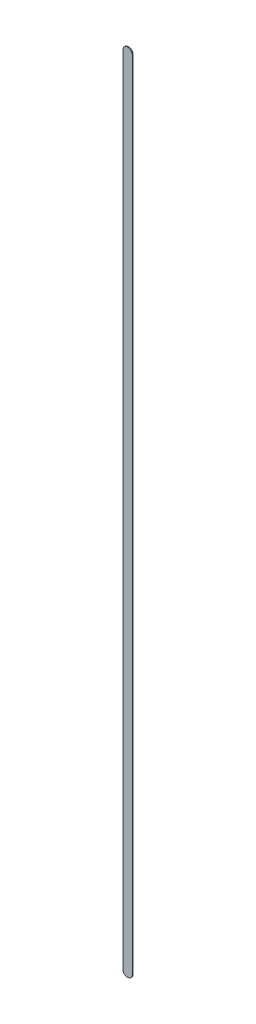
ISO-10303-21;
HEADER;
FILE_DESCRIPTION(('STEP AP214'),'2;1');
FILE_NAME('part.step','',(''),(''),'','','');
FILE_SCHEMA(('AUTOMOTIVE_DESIGN { 1 0 10303 214 1 1 1 1 }'));
ENDSEC;
DATA;
#1=APPLICATION_CONTEXT('core data for automotive mechanical design processes');
#2=APPLICATION_PROTOCOL_DEFINITION('international standard','automotive_design',2000,#1);
#3=PRODUCT_CONTEXT('',#1,'mechanical');
#4=PRODUCT('Part','Part','',(#3));
#5=PRODUCT_RELATED_PRODUCT_CATEGORY('part','',(#4));
#6=PRODUCT_DEFINITION_FORMATION('','',#4);
#7=PRODUCT_DEFINITION_CONTEXT('part definition',#1,'design');
#8=PRODUCT_DEFINITION('design','',#6,#7);
#9=PRODUCT_DEFINITION_SHAPE('','',#8);
#10=(LENGTH_UNIT() NAMED_UNIT(*) SI_UNIT(.MILLI.,.METRE.));
#11=(NAMED_UNIT(*) PLANE_ANGLE_UNIT() SI_UNIT($,.RADIAN.));
#12=(NAMED_UNIT(*) SI_UNIT($,.STERADIAN.) SOLID_ANGLE_UNIT());
#13=UNCERTAINTY_MEASURE_WITH_UNIT(LENGTH_MEASURE(1.E-05),#10,'distance_accuracy_value','');
#14=(GEOMETRIC_REPRESENTATION_CONTEXT(3) GLOBAL_UNCERTAINTY_ASSIGNED_CONTEXT((#13)) GLOBAL_UNIT_ASSIGNED_CONTEXT((#10,
#11,#12)) REPRESENTATION_CONTEXT('',''));
#15=CARTESIAN_POINT('',(0.,0.,0.));
#16=DIRECTION('',(0.,0.,1.));
#17=DIRECTION('',(1.,0.,0.));
#18=AXIS2_PLACEMENT_3D('',#15,#16,#17);
#19=CARTESIAN_POINT('',(34.375,48.9125,1.1596000001));
#20=DIRECTION('',(0.,0.,1.));
#21=DIRECTION('',(1.,0.,0.));
#22=AXIS2_PLACEMENT_3D('',#19,#20,#21);
#23=PLANE('',#22);
#24=DIRECTION('',(0.,1.,0.));
#25=VECTOR('',#24,1.);
#26=CARTESIAN_POINT('',(34.3,42.6625,1.1596000001));
#27=LINE('',#26,#25);
#28=CARTESIAN_POINT('',(34.3,42.6625,1.1596000001));
#29=VERTEX_POINT('',#28);
#30=CARTESIAN_POINT('',(34.3,55.1625,1.1596000001));
#31=VERTEX_POINT('',#30);
#32=EDGE_CURVE('E99',#29,#31,#27,.T.);
#33=ORIENTED_EDGE('',*,*,#32,.T.);
#34=CARTESIAN_POINT('',(34.375,55.1625,1.1596000001));
#35=DIRECTION('',(0.,0.,1.));
#36=DIRECTION('',(1.,0.,0.));
#37=AXIS2_PLACEMENT_3D('',#34,#35,#36);
#38=CIRCLE('',#37,0.075);
#39=CARTESIAN_POINT('',(34.45,55.1625,1.1596000001));
#40=VERTEX_POINT('',#39);
#41=EDGE_CURVE('E74',#40,#31,#38,.T.);
#42=ORIENTED_EDGE('',*,*,#41,.F.);
#43=DIRECTION('',(0.,-1.,0.));
#44=VECTOR('',#43,1.);
#45=CARTESIAN_POINT('',(34.45,55.1625,1.1596000001));
#46=LINE('',#45,#44);
#47=CARTESIAN_POINT('',(34.45,42.6625,1.1596000001));
#48=VERTEX_POINT('',#47);
#49=EDGE_CURVE('E27',#40,#48,#46,.T.);
#50=ORIENTED_EDGE('',*,*,#49,.T.);
#51=CARTESIAN_POINT('',(34.375,42.6625,1.1596000001));
#52=DIRECTION('',(0.,0.,1.));
#53=DIRECTION('',(1.,0.,0.));
#54=AXIS2_PLACEMENT_3D('',#51,#52,#53);
#55=CIRCLE('',#54,0.075);
#56=EDGE_CURVE('E11',#29,#48,#55,.T.);
#57=ORIENTED_EDGE('',*,*,#56,.F.);
#58=EDGE_LOOP('',(#33,#42,#50,#57));
#59=FACE_BOUND('',#58,.T.);
#60=ADVANCED_FACE('F17',(#59),#23,.F.);
#61=CARTESIAN_POINT('',(34.375,42.6625,1.1596000001));
#62=DIRECTION('',(0.,0.,1.));
#63=DIRECTION('',(1.,0.,0.));
#64=AXIS2_PLACEMENT_3D('',#61,#62,#63);
#65=CYLINDRICAL_SURFACE('',#64,0.075);
#66=ORIENTED_EDGE('',*,*,#56,.T.);
#67=DIRECTION('',(0.,0.,1.));
#68=VECTOR('',#67,1.);
#69=CARTESIAN_POINT('',(34.45,42.6625,1.1596000001));
#70=LINE('',#69,#68);
#71=CARTESIAN_POINT('',(34.45,42.6625,1.1723000001));
#72=VERTEX_POINT('',#71);
#73=EDGE_CURVE('E73',#48,#72,#70,.T.);
#74=ORIENTED_EDGE('',*,*,#73,.T.);
#75=CARTESIAN_POINT('',(34.375,42.6625,1.1723000001));
#76=DIRECTION('',(0.,0.,1.));
#77=DIRECTION('',(1.,0.,0.));
#78=AXIS2_PLACEMENT_3D('',#75,#76,#77);
#79=CIRCLE('',#78,0.075);
#80=CARTESIAN_POINT('',(34.3,42.6625,1.1723000001));
#81=VERTEX_POINT('',#80);
#82=EDGE_CURVE('E82',#81,#72,#79,.T.);
#83=ORIENTED_EDGE('',*,*,#82,.F.);
#84=DIRECTION('',(0.,0.,-1.));
#85=VECTOR('',#84,1.);
#86=CARTESIAN_POINT('',(34.3,42.6625,1.1596000001));
#87=LINE('',#86,#85);
#88=EDGE_CURVE('E102',#81,#29,#87,.T.);
#89=ORIENTED_EDGE('',*,*,#88,.T.);
#90=EDGE_LOOP('',(#66,#74,#83,#89));
#91=FACE_BOUND('',#90,.T.);
#92=ADVANCED_FACE('F19',(#91),#65,.T.);
#93=CARTESIAN_POINT('',(34.45,55.1625,1.1596000001));
#94=DIRECTION('',(-1.,0.,0.));
#95=DIRECTION('',(0.,0.,1.));
#96=AXIS2_PLACEMENT_3D('',#93,#94,#95);
#97=PLANE('',#96);
#98=ORIENTED_EDGE('',*,*,#73,.F.);
#99=ORIENTED_EDGE('',*,*,#49,.F.);
#100=DIRECTION('',(0.,0.,-1.));
#101=VECTOR('',#100,1.);
#102=CARTESIAN_POINT('',(34.45,55.1625,1.1596000001));
#103=LINE('',#102,#101);
#104=CARTESIAN_POINT('',(34.45,55.1625,1.1723000001));
#105=VERTEX_POINT('',#104);
#106=EDGE_CURVE('E63',#105,#40,#103,.T.);
#107=ORIENTED_EDGE('',*,*,#106,.F.);
#108=DIRECTION('',(0.,1.,0.));
#109=VECTOR('',#108,1.);
#110=CARTESIAN_POINT('',(34.45,48.9125,1.1723000001));
#111=LINE('',#110,#109);
#112=EDGE_CURVE('E67',#72,#105,#111,.T.);
#113=ORIENTED_EDGE('',*,*,#112,.F.);
#114=EDGE_LOOP('',(#98,#99,#107,#113));
#115=FACE_BOUND('',#114,.T.);
#116=ADVANCED_FACE('F66',(#115),#97,.F.);
#117=CARTESIAN_POINT('',(34.375,55.1625,1.1596000001));
#118=DIRECTION('',(0.,0.,1.));
#119=DIRECTION('',(1.,0.,0.));
#120=AXIS2_PLACEMENT_3D('',#117,#118,#119);
#121=CYLINDRICAL_SURFACE('',#120,0.075);
#122=ORIENTED_EDGE('',*,*,#41,.T.);
#123=DIRECTION('',(0.,0.,1.));
#124=VECTOR('',#123,1.);
#125=CARTESIAN_POINT('',(34.3,55.1625,1.1596000001));
#126=LINE('',#125,#124);
#127=CARTESIAN_POINT('',(34.3,55.1625,1.1723000001));
#128=VERTEX_POINT('',#127);
#129=EDGE_CURVE('E84',#31,#128,#126,.T.);
#130=ORIENTED_EDGE('',*,*,#129,.T.);
#131=CARTESIAN_POINT('',(34.375,55.1625,1.1723000001));
#132=DIRECTION('',(0.,0.,1.));
#133=DIRECTION('',(1.,0.,0.));
#134=AXIS2_PLACEMENT_3D('',#131,#132,#133);
#135=CIRCLE('',#134,0.075);
#136=EDGE_CURVE('E80',#105,#128,#135,.T.);
#137=ORIENTED_EDGE('',*,*,#136,.F.);
#138=ORIENTED_EDGE('',*,*,#106,.T.);
#139=EDGE_LOOP('',(#122,#130,#137,#138));
#140=FACE_BOUND('',#139,.T.);
#141=ADVANCED_FACE('F86',(#140),#121,.T.);
#142=CARTESIAN_POINT('',(34.3,42.6625,1.1596000001));
#143=DIRECTION('',(1.,0.,0.));
#144=DIRECTION('',(0.,1.,0.));
#145=AXIS2_PLACEMENT_3D('',#142,#143,#144);
#146=PLANE('',#145);
#147=ORIENTED_EDGE('',*,*,#129,.F.);
#148=ORIENTED_EDGE('',*,*,#32,.F.);
#149=ORIENTED_EDGE('',*,*,#88,.F.);
#150=DIRECTION('',(0.,-1.,0.));
#151=VECTOR('',#150,1.);
#152=CARTESIAN_POINT('',(34.3,48.9125,1.1723000001));
#153=LINE('',#152,#151);
#154=EDGE_CURVE('E90',#128,#81,#153,.T.);
#155=ORIENTED_EDGE('',*,*,#154,.F.);
#156=EDGE_LOOP('',(#147,#148,#149,#155));
#157=FACE_BOUND('',#156,.T.);
#158=ADVANCED_FACE('F124',(#157),#146,.F.);
#159=CARTESIAN_POINT('',(34.375,48.9125,1.1723000001));
#160=DIRECTION('',(0.,0.,1.));
#161=DIRECTION('',(1.,0.,0.));
#162=AXIS2_PLACEMENT_3D('',#159,#160,#161);
#163=PLANE('',#162);
#164=ORIENTED_EDGE('',*,*,#136,.T.);
#165=ORIENTED_EDGE('',*,*,#154,.T.);
#166=ORIENTED_EDGE('',*,*,#82,.T.);
#167=ORIENTED_EDGE('',*,*,#112,.T.);
#168=EDGE_LOOP('',(#164,#165,#166,#167));
#169=FACE_BOUND('',#168,.T.);
#170=ADVANCED_FACE('F78',(#169),#163,.T.);
#171=CLOSED_SHELL('',(#60,#92,#116,#141,#158,#170));
#172=MANIFOLD_SOLID_BREP('B1',#171);
#173=ADVANCED_BREP_SHAPE_REPRESENTATION('',(#18,#172),#14);
#174=SHAPE_DEFINITION_REPRESENTATION(#9,#173);
ENDSEC;
END-ISO-10303-21;
